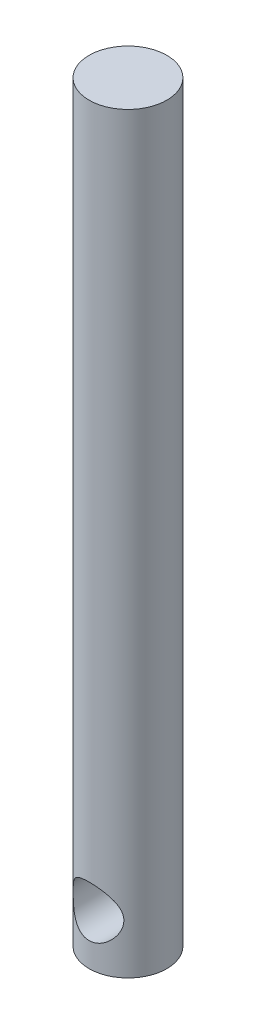
ISO-10303-21;
HEADER;
FILE_DESCRIPTION(('STEP AP214'),'2;1');
FILE_NAME('part.step','',(''),(''),'','','');
FILE_SCHEMA(('AUTOMOTIVE_DESIGN { 1 0 10303 214 1 1 1 1 }'));
ENDSEC;
DATA;
#1=APPLICATION_CONTEXT('core data for automotive mechanical design processes');
#2=APPLICATION_PROTOCOL_DEFINITION('international standard','automotive_design',2000,#1);
#3=PRODUCT_CONTEXT('',#1,'mechanical');
#4=PRODUCT('Part','Part','',(#3));
#5=PRODUCT_RELATED_PRODUCT_CATEGORY('part','',(#4));
#6=PRODUCT_DEFINITION_FORMATION('','',#4);
#7=PRODUCT_DEFINITION_CONTEXT('part definition',#1,'design');
#8=PRODUCT_DEFINITION('design','',#6,#7);
#9=PRODUCT_DEFINITION_SHAPE('','',#8);
#10=(LENGTH_UNIT() NAMED_UNIT(*) SI_UNIT(.MILLI.,.METRE.));
#11=(NAMED_UNIT(*) PLANE_ANGLE_UNIT() SI_UNIT($,.RADIAN.));
#12=(NAMED_UNIT(*) SI_UNIT($,.STERADIAN.) SOLID_ANGLE_UNIT());
#13=UNCERTAINTY_MEASURE_WITH_UNIT(LENGTH_MEASURE(1.E-05),#10,'distance_accuracy_value','');
#14=(GEOMETRIC_REPRESENTATION_CONTEXT(3) GLOBAL_UNCERTAINTY_ASSIGNED_CONTEXT((#13)) GLOBAL_UNIT_ASSIGNED_CONTEXT((#10,
#11,#12)) REPRESENTATION_CONTEXT('',''));
#15=CARTESIAN_POINT('',(0.,0.,0.));
#16=DIRECTION('',(0.,0.,1.));
#17=DIRECTION('',(1.,0.,0.));
#18=AXIS2_PLACEMENT_3D('',#15,#16,#17);
#19=CARTESIAN_POINT('',(0.,3.,0.));
#20=DIRECTION('',(0.,-1.,0.));
#21=DIRECTION('',(0.,0.,-1.));
#22=AXIS2_PLACEMENT_3D('',#19,#20,#21);
#23=CYLINDRICAL_SURFACE('',#22,0.154999999999999);
#24=CARTESIAN_POINT('',(0.,0.299382501811478,-0.154999999999999));
#25=CARTESIAN_POINT('',(-0.00510155987039301,0.299382328133032,-0.154999833363666));
#26=CARTESIAN_POINT('',(-0.0102047309307233,0.298994230021796,-0.154745820783571));
#27=CARTESIAN_POINT('',(-0.0202497795640315,0.297464879941275,-0.153754621499907));
#28=CARTESIAN_POINT('',(-0.0251915264548893,0.296323032887724,-0.153017053032442));
#29=CARTESIAN_POINT('',(-0.0347529387368662,0.293355014721475,-0.151132024552539));
#30=CARTESIAN_POINT('',(-0.0393740024668094,0.291532069323346,-0.149986497828907));
#31=CARTESIAN_POINT('',(-0.0482271863874688,0.287278342839878,-0.147378650966754));
#32=CARTESIAN_POINT('',(-0.0524592645266393,0.284847496142411,-0.145916296634607));
#33=CARTESIAN_POINT('',(-0.0608119302056026,0.279225765670881,-0.142648711989332));
#34=CARTESIAN_POINT('',(-0.0648939246885334,0.275988464313859,-0.140825074530427));
#35=CARTESIAN_POINT('',(-0.0724939151521711,0.268955146203978,-0.137068037272034));
#36=CARTESIAN_POINT('',(-0.0760111097281749,0.265158349959395,-0.135134486687477));
#37=CARTESIAN_POINT('',(-0.0829205474763118,0.25645029737463,-0.131025299192661));
#38=CARTESIAN_POINT('',(-0.0862148559509345,0.251457301091512,-0.128856870006713));
#39=CARTESIAN_POINT('',(-0.0919114575808491,0.240864083451846,-0.124857569093003));
#40=CARTESIAN_POINT('',(-0.0943152906617541,0.235264932218139,-0.123026117407613));
#41=CARTESIAN_POINT('',(-0.0975767036741745,0.225196023566708,-0.120444401937135));
#42=CARTESIAN_POINT('',(-0.0986785221100334,0.220846530000073,-0.119535063091466));
#43=CARTESIAN_POINT('',(-0.100297420261631,0.211972414183993,-0.118180259517313));
#44=CARTESIAN_POINT('',(-0.100815443471888,0.207448086767869,-0.117734046405562));
#45=CARTESIAN_POINT('',(-0.101234682034223,0.198332739752568,-0.117373900933424));
#46=CARTESIAN_POINT('',(-0.101133720461464,0.193741541492049,-0.11746184716279));
#47=CARTESIAN_POINT('',(-0.100317207531066,0.184653080252213,-0.11815972138777));
#48=CARTESIAN_POINT('',(-0.0996011404561673,0.180155899340838,-0.118770087389453));
#49=CARTESIAN_POINT('',(-0.0976358181527735,0.171535798676903,-0.12039008313915));
#50=CARTESIAN_POINT('',(-0.0964067777515211,0.167405226039614,-0.121384478601136));
#51=CARTESIAN_POINT('',(-0.0934701092745859,0.159403671751443,-0.123659941488426));
#52=CARTESIAN_POINT('',(-0.0917623238469365,0.155532775969373,-0.124941103138924));
#53=CARTESIAN_POINT('',(-0.087528533406621,0.147343119588086,-0.127952156978528));
#54=CARTESIAN_POINT('',(-0.0849074238337304,0.143087813750175,-0.129720650637531));
#55=CARTESIAN_POINT('',(-0.0790900435376105,0.135028383523044,-0.133347459975715));
#56=CARTESIAN_POINT('',(-0.0758930754649362,0.131224815546936,-0.135205882538498));
#57=CARTESIAN_POINT('',(-0.0682754787782161,0.123408378506674,-0.13923176246055));
#58=CARTESIAN_POINT('',(-0.0637378741188222,0.119502374444192,-0.141387816993789));
#59=CARTESIAN_POINT('',(-0.0539568030894079,0.112505439838433,-0.145401239817562));
#60=CARTESIAN_POINT('',(-0.0487140612527303,0.10941368217192,-0.147258910456376));
#61=CARTESIAN_POINT('',(-0.0387295340453946,0.104700097666853,-0.150154787932463));
#62=CARTESIAN_POINT('',(-0.0340939123770077,0.10290846243509,-0.15128241069537));
#63=CARTESIAN_POINT('',(-0.024534443129099,0.100013853558087,-0.153123101791206));
#64=CARTESIAN_POINT('',(-0.0196108372492415,0.0989103112294573,-0.153836512421513));
#65=CARTESIAN_POINT('',(-0.00958843279961988,0.0974472862281757,-0.15478526722175));
#66=CARTESIAN_POINT('',(-0.00448904434429662,0.0970906210096371,-0.15501880108462));
#67=CARTESIAN_POINT('',(0.00570334256904216,0.0971518804683452,-0.154978820647786));
#68=CARTESIAN_POINT('',(0.0107963409945298,0.0975698090727134,-0.15470530377738));
#69=CARTESIAN_POINT('',(0.0205063424883452,0.0991057358939189,-0.153710374104947));
#70=CARTESIAN_POINT('',(0.0251334418764158,0.100179535117928,-0.153017262029598));
#71=CARTESIAN_POINT('',(0.0341281616730916,0.102935701190488,-0.151265603658937));
#72=CARTESIAN_POINT('',(0.0384957399811975,0.10461816646707,-0.150206998260578));
#73=CARTESIAN_POINT('',(0.047179157795949,0.108661863389083,-0.147719002713079));
#74=CARTESIAN_POINT('',(0.051471070488421,0.111061619263233,-0.146269219693313));
#75=CARTESIAN_POINT('',(0.0596091401401336,0.116409136691082,-0.143146030170823));
#76=CARTESIAN_POINT('',(0.06345497885447,0.119357285630694,-0.141472465824963));
#77=CARTESIAN_POINT('',(0.0712232159264719,0.126238377090279,-0.13774459306432));
#78=CARTESIAN_POINT('',(0.0750642070730206,0.130253187123094,-0.135671586051804));
#79=CARTESIAN_POINT('',(0.0820504848334758,0.138870076835235,-0.131564215707623));
#80=CARTESIAN_POINT('',(0.0851954582884425,0.143472419400311,-0.129529870145658));
#81=CARTESIAN_POINT('',(0.0904056119656142,0.152655065511205,-0.125939129351962));
#82=CARTESIAN_POINT('',(0.0925532695294196,0.157177346335066,-0.124354677231423));
#83=CARTESIAN_POINT('',(0.096180168293496,0.166591917479324,-0.121571509532941));
#84=CARTESIAN_POINT('',(0.0976606152274104,0.171483521549858,-0.120372099273919));
#85=CARTESIAN_POINT('',(0.099702284452514,0.180759232572636,-0.118684229029616));
#86=CARTESIAN_POINT('',(0.10037034600356,0.185104640205748,-0.118114441240575));
#87=CARTESIAN_POINT('',(0.10113279570465,0.193880586468323,-0.117462477956658));
#88=CARTESIAN_POINT('',(0.101227652949845,0.198311052508337,-0.117379903740466));
#89=CARTESIAN_POINT('',(0.100838064455578,0.207123782503536,-0.11771464290933));
#90=CARTESIAN_POINT('',(0.10035394029282,0.211506071853117,-0.118131678802153));
#91=CARTESIAN_POINT('',(0.0988376244331075,0.220110977781033,-0.119402993907774));
#92=CARTESIAN_POINT('',(0.0978047225301009,0.224333379836539,-0.120257839664686));
#93=CARTESIAN_POINT('',(0.0948677810386326,0.233725092956565,-0.122595032804747));
#94=CARTESIAN_POINT('',(0.0927981504478398,0.238814848652576,-0.124187379791673));
#95=CARTESIAN_POINT('',(0.0879255074462918,0.24851279738789,-0.127683538538626));
#96=CARTESIAN_POINT('',(0.0851214883126857,0.25312031713311,-0.129587776495663));
#97=CARTESIAN_POINT('',(0.078797262840741,0.261876341228093,-0.133529396346754));
#98=CARTESIAN_POINT('',(0.0752663545522886,0.266016359741902,-0.135568416532456));
#99=CARTESIAN_POINT('',(0.0675637694787689,0.273698372124937,-0.139567106265612));
#100=CARTESIAN_POINT('',(0.063391930695129,0.277240214325476,-0.141526755592981));
#101=CARTESIAN_POINT('',(0.0539775254771847,0.283989072436128,-0.145396009436751));
#102=CARTESIAN_POINT('',(0.0486682153198422,0.28712008111048,-0.147277981901897));
#103=CARTESIAN_POINT('',(0.0374402677101189,0.292400102108362,-0.150522841139285));
#104=CARTESIAN_POINT('',(0.0315229816168788,0.294551236926019,-0.151886848792221));
#105=CARTESIAN_POINT('',(0.0212956062110828,0.297206394211437,-0.15358695324426));
#106=CARTESIAN_POINT('',(0.0170953119708869,0.298019278118353,-0.154113479866054));
#107=CARTESIAN_POINT('',(0.00859703693743253,0.299107311820518,-0.154820013347789));
#108=CARTESIAN_POINT('',(0.0042990905581893,0.299382648170511,-0.155000140424634));
#109=CARTESIAN_POINT('',(0.,0.299382501811478,-0.154999999999999));
#110=B_SPLINE_CURVE_WITH_KNOTS('',3,(#24,#25,#26,#27,#28,#29,#30,#31,#32,#33,#34,#35,#36,#37,
#38,#39,#40,#41,#42,#43,#44,#45,#46,#47,#48,#49,#50,#51,#52,#53,#54,#55,#56,#57,#58,#59,#60,#61,
#62,#63,#64,#65,#66,#67,#68,#69,#70,#71,#72,#73,#74,#75,#76,#77,#78,#79,#80,#81,#82,#83,#84,#85,
#86,#87,#88,#89,#90,#91,#92,#93,#94,#95,#96,#97,#98,#99,#100,#101,#102,#103,#104,#105,#106,#107,
#108,#109),.UNSPECIFIED.,.T.,.F.,(4,2,2,2,2,2,2,2,2,2,2,2,2,2,2,2,2,2,2,2,2,2,2,2,2,2,2,2,2,2,2,
2,2,2,2,2,2,2,2,2,2,2,4),(0.,0.0152872280739053,0.0305865398618452,0.0458142933827981,
0.0610436911787003,0.077540577688191,0.0940606689500905,0.113059545252004,0.132025411131395,
0.145704355514299,0.15936116096915,0.173066023910551,0.186782388522006,0.200002805657007,
0.2132275731298,0.229075438813019,0.244942626468061,0.263941607928058,0.282921214851165,
0.298145069911989,0.313356326283403,0.328624861658907,0.343893474444733,0.35823192911358,
0.37257270350631,0.387893368138277,0.403224896702438,0.420944840955464,0.438672741799452,
0.454367222157433,0.470033225756928,0.483273476067732,0.496502889440959,0.509724958370876,
0.522964180600661,0.540034433076922,0.557128209597159,0.574494416772171,0.591865020591326,
0.611088395432813,0.630269930377906,0.643156968836343,0.656039534079736),.UNSPECIFIED.);
#111=CARTESIAN_POINT('',(0.,0.299382501811478,-0.154999999999999));
#112=VERTEX_POINT('',#111);
#113=EDGE_CURVE('E35',#112,#112,#110,.T.);
#114=ORIENTED_EDGE('',*,*,#113,.T.);
#115=EDGE_LOOP('',(#114));
#116=FACE_BOUND('',#115,.T.);
#117=CARTESIAN_POINT('',(0.10113153680832,0.198250965003158,0.117462386587312));
#118=CARTESIAN_POINT('',(0.101131136683058,0.193281854870927,0.117463061639228));
#119=CARTESIAN_POINT('',(0.10076213516487,0.18830974813429,0.117783545385437));
#120=CARTESIAN_POINT('',(0.0993157068549294,0.178540731856244,0.119005087902556));
#121=CARTESIAN_POINT('',(0.0982369873383142,0.173744158904652,0.119907206038618));
#122=CARTESIAN_POINT('',(0.0954532958023699,0.164496063713036,0.122134268014775));
#123=CARTESIAN_POINT('',(0.0937540952602827,0.16004180540339,0.123455300827067));
#124=CARTESIAN_POINT('',(0.089794447276358,0.151487873126067,0.126364499889063));
#125=CARTESIAN_POINT('',(0.0875338747942851,0.147388278431004,0.127952725627983));
#126=CARTESIAN_POINT('',(0.0821266195628282,0.138994891620878,0.131499602494675));
#127=CARTESIAN_POINT('',(0.0788983112986412,0.134762140662917,0.133478289564573));
#128=CARTESIAN_POINT('',(0.0718132028114513,0.126845792087752,0.137420288544412));
#129=CARTESIAN_POINT('',(0.0679558270605848,0.123162703316896,0.139383584632989));
#130=CARTESIAN_POINT('',(0.0590887618072945,0.115952614865607,0.143388493382795));
#131=CARTESIAN_POINT('',(0.0539937097519762,0.112514897423749,0.145404470847004));
#132=CARTESIAN_POINT('',(0.0431407210354922,0.106574367986442,0.148984561891494));
#133=CARTESIAN_POINT('',(0.0373835021850027,0.104070555873939,0.150549158445275));
#134=CARTESIAN_POINT('',(0.0260281452621585,0.100364237019032,0.152896725055294));
#135=CARTESIAN_POINT('',(0.0204805999968233,0.0990499601922443,0.153746114234103));
#136=CARTESIAN_POINT('',(0.00918665088745573,0.0973764705248085,0.154831030955715));
#137=CARTESIAN_POINT('',(0.00344049080874038,0.0970161263066068,0.155067285678099));
#138=CARTESIAN_POINT('',(-0.00717949081173887,0.0972556245642492,0.154911237488159));
#139=CARTESIAN_POINT('',(-0.0120583021945274,0.0977230815395555,0.15460558901381));
#140=CARTESIAN_POINT('',(-0.0216511670536507,0.0993445920529235,0.153556173186866));
#141=CARTESIAN_POINT('',(-0.0263652082684825,0.100498696573725,0.152812373302106));
#142=CARTESIAN_POINT('',(-0.0355039697456552,0.103434918985987,0.150951029298143));
#143=CARTESIAN_POINT('',(-0.0399291314754913,0.105216050690061,0.149834072219891));
#144=CARTESIAN_POINT('',(-0.0484188394734762,0.109338120365198,0.147310061225599));
#145=CARTESIAN_POINT('',(-0.0524833146999479,0.111679168284654,0.145902950340765));
#146=CARTESIAN_POINT('',(-0.0607004509352331,0.11719177005083,0.142696633310057));
#147=CARTESIAN_POINT('',(-0.0647966253391265,0.120431554817371,0.140870255864793));
#148=CARTESIAN_POINT('',(-0.0724229957727844,0.127473179202689,0.137105958459395));
#149=CARTESIAN_POINT('',(-0.075952311443807,0.131275875784115,0.135167871231414));
#150=CARTESIAN_POINT('',(-0.0828747542412799,0.139986672427158,0.131054320354818));
#151=CARTESIAN_POINT('',(-0.0861717177329037,0.144975095588293,0.128885808224173));
#152=CARTESIAN_POINT('',(-0.0918746136222452,0.155558843203593,0.124884765475558));
#153=CARTESIAN_POINT('',(-0.0942821131750731,0.161153077559167,0.123051646829963));
#154=CARTESIAN_POINT('',(-0.0975522374743703,0.171217256739838,0.12046429364037));
#155=CARTESIAN_POINT('',(-0.0986583144872165,0.175567039867813,0.119551789029142));
#156=CARTESIAN_POINT('',(-0.100285562595062,0.184442631619378,0.118190369652004));
#157=CARTESIAN_POINT('',(-0.100807673401985,0.18896814527903,0.117740710174078));
#158=CARTESIAN_POINT('',(-0.101234670822928,0.198086971514838,0.117373924126819));
#159=CARTESIAN_POINT('',(-0.101137358899071,0.202680467791004,0.117458694416797));
#160=CARTESIAN_POINT('',(-0.100327402757443,0.21177420048876,0.118151045972862));
#161=CARTESIAN_POINT('',(-0.0996142460743172,0.2162743560439,0.118759062648601));
#162=CARTESIAN_POINT('',(-0.0976545181096301,0.224897590448466,0.120374874350908));
#163=CARTESIAN_POINT('',(-0.0964285617518855,0.229028452949988,0.121367119353009));
#164=CARTESIAN_POINT('',(-0.0934980197414877,0.237030968445279,0.123638786057206));
#165=CARTESIAN_POINT('',(-0.0917932763010492,0.240902535464518,0.124918302403741));
#166=CARTESIAN_POINT('',(-0.0875670490262214,0.249092261183829,0.127925690211492));
#167=CARTESIAN_POINT('',(-0.0849506991511945,0.253347185064987,0.129692180306252));
#168=CARTESIAN_POINT('',(-0.0791433297975319,0.261406597705867,0.133315708907116));
#169=CARTESIAN_POINT('',(-0.0759516146200866,0.26521053182119,0.135172855024805));
#170=CARTESIAN_POINT('',(-0.06834453815415,0.273030361360885,0.139197723584608));
#171=CARTESIAN_POINT('',(-0.0638120158467401,0.27693932674208,0.1413542083998));
#172=CARTESIAN_POINT('',(-0.0540410378704531,0.283943286064196,0.145369801541898));
#173=CARTESIAN_POINT('',(-0.0488033014815186,0.287039100003983,0.147229208700905));
#174=CARTESIAN_POINT('',(-0.0388244976018606,0.291762528329608,0.150130255456834));
#175=CARTESIAN_POINT('',(-0.0341894465700782,0.293559325404956,0.151260865234814));
#176=CARTESIAN_POINT('',(-0.0246301307614302,0.296464201208652,0.153107755723587));
#177=CARTESIAN_POINT('',(-0.0197061087346825,0.297572849202809,0.153824378867395));
#178=CARTESIAN_POINT('',(-0.00968169465291945,0.299045817327752,0.154779505190189));
#179=CARTESIAN_POINT('',(-0.00458070572514956,0.299407305080318,0.155016188923195));
#180=CARTESIAN_POINT('',(0.00561586402468822,0.299355049616794,0.154982082761091));
#181=CARTESIAN_POINT('',(0.0107114448280555,0.298941303728726,0.154711291116879));
#182=CARTESIAN_POINT('',(0.0204252803737714,0.297412940978942,0.153721187520802));
#183=CARTESIAN_POINT('',(0.0250536497460805,0.296342831239949,0.153030380366724));
#184=CARTESIAN_POINT('',(0.0340514457867952,0.29359368366945,0.151282924778947));
#185=CARTESIAN_POINT('',(0.0384208311890564,0.291914549098611,0.150226218225898));
#186=CARTESIAN_POINT('',(0.0471067571539595,0.287878088118725,0.147742103706588));
#187=CARTESIAN_POINT('',(0.051399533551679,0.285482432159996,0.146294385951304));
#188=CARTESIAN_POINT('',(0.0595398886557225,0.280143108244317,0.143174860511628));
#189=CARTESIAN_POINT('',(0.0633871522884602,0.277199056245344,0.141502896018276));
#190=CARTESIAN_POINT('',(0.0711585848875637,0.270327246744026,0.137778013294817));
#191=CARTESIAN_POINT('',(0.0750015062625798,0.266317700167272,0.135706307483161));
#192=CARTESIAN_POINT('',(0.0819928620387818,0.257711165465115,0.131600199316514));
#193=CARTESIAN_POINT('',(0.0851409289914832,0.253113868548844,0.129565817217671));
#194=CARTESIAN_POINT('',(0.0903615642977304,0.243934708661875,0.125970907791047));
#195=CARTESIAN_POINT('',(0.0925156045316512,0.239410195082264,0.124382806829518));
#196=CARTESIAN_POINT('',(0.096153400241032,0.229991379147495,0.121592814961244));
#197=CARTESIAN_POINT('',(0.0976387140435035,0.225097967852804,0.120390028069064));
#198=CARTESIAN_POINT('',(0.0995327299203725,0.216526811232121,0.118824525419298));
#199=CARTESIAN_POINT('',(0.100129796048406,0.212916485972783,0.118318646213122));
#200=CARTESIAN_POINT('',(0.100929293280501,0.20562163125807,0.117637372157442));
#201=CARTESIAN_POINT('',(0.101131833627016,0.20193712262932,0.117461885824055));
#202=CARTESIAN_POINT('',(0.10113153680832,0.198250965003158,0.117462386587312));
#203=B_SPLINE_CURVE_WITH_KNOTS('',3,(#117,#118,#119,#120,#121,#122,#123,#124,#125,#126,#127,
#128,#129,#130,#131,#132,#133,#134,#135,#136,#137,#138,#139,#140,#141,#142,#143,#144,#145,#146,
#147,#148,#149,#150,#151,#152,#153,#154,#155,#156,#157,#158,#159,#160,#161,#162,#163,#164,#165,
#166,#167,#168,#169,#170,#171,#172,#173,#174,#175,#176,#177,#178,#179,#180,#181,#182,#183,#184,
#185,#186,#187,#188,#189,#190,#191,#192,#193,#194,#195,#196,#197,#198,#199,#200,#201,#202),
.UNSPECIFIED.,.T.,.F.,(4,2,2,2,2,2,2,2,2,2,2,2,2,2,2,2,2,2,2,2,2,2,2,2,2,2,2,2,2,2,2,2,2,2,2,2,
2,2,2,2,2,2,4),(0.,0.0148905948592171,0.0298083877506458,0.0445908155963651,0.0593765390446098,
0.0763503298284211,0.0933397378003284,0.112638703101767,0.131916941440797,0.149102118347178,
0.166266904240536,0.180928053676684,0.195590291821106,0.210229571496469,0.224871728189181,
0.241406159569431,0.257966026470104,0.276958485331859,0.29591731978489,0.309602074113485,
0.323264775261685,0.336975996867797,0.350698639053979,0.363915831747972,0.377137385385973,
0.392975334393951,0.408832563786116,0.427826692585126,0.446801593125745,0.462031315918929,
0.477248423196464,0.492523111345575,0.507797852141652,0.522136474816371,0.536477376079173,
0.551792719867929,0.567118829599397,0.584830592557755,0.602551699416546,0.618263571171081,
0.633938637750765,0.644987755853304,0.656033814068511),.UNSPECIFIED.);
#204=CARTESIAN_POINT('',(0.10113153680832,0.198250965003158,0.117462386587312));
#205=VERTEX_POINT('',#204);
#206=EDGE_CURVE('E48',#205,#205,#203,.T.);
#207=ORIENTED_EDGE('',*,*,#206,.T.);
#208=EDGE_LOOP('',(#207));
#209=FACE_BOUND('',#208,.T.);
#210=CARTESIAN_POINT('',(0.,3.,0.));
#211=DIRECTION('',(0.,1.,0.));
#212=DIRECTION('',(0.,0.,1.));
#213=AXIS2_PLACEMENT_3D('',#210,#211,#212);
#214=CIRCLE('',#213,0.154999999999999);
#215=CARTESIAN_POINT('',(0.,3.,0.154999999999999));
#216=VERTEX_POINT('',#215);
#217=EDGE_CURVE('E10',#216,#216,#214,.T.);
#218=ORIENTED_EDGE('',*,*,#217,.F.);
#219=EDGE_LOOP('',(#218));
#220=FACE_BOUND('',#219,.T.);
#221=CARTESIAN_POINT('',(0.,0.,0.));
#222=DIRECTION('',(0.,1.,0.));
#223=DIRECTION('',(0.,0.,1.));
#224=AXIS2_PLACEMENT_3D('',#221,#222,#223);
#225=CIRCLE('',#224,0.154999999999999);
#226=CARTESIAN_POINT('',(0.,0.,0.154999999999999));
#227=VERTEX_POINT('',#226);
#228=EDGE_CURVE('E42',#227,#227,#225,.T.);
#229=ORIENTED_EDGE('',*,*,#228,.T.);
#230=EDGE_LOOP('',(#229));
#231=FACE_BOUND('',#230,.T.);
#232=ADVANCED_FACE('F31',(#116,#209,#220,#231),#23,.T.);
#233=CARTESIAN_POINT('',(0.,3.,0.));
#234=DIRECTION('',(0.,1.,0.));
#235=DIRECTION('',(0.,0.,1.));
#236=AXIS2_PLACEMENT_3D('',#233,#234,#235);
#237=PLANE('',#236);
#238=ORIENTED_EDGE('',*,*,#217,.T.);
#239=EDGE_LOOP('',(#238));
#240=FACE_BOUND('',#239,.T.);
#241=ADVANCED_FACE('F58',(#240),#237,.T.);
#242=CARTESIAN_POINT('',(0.,0.,0.));
#243=DIRECTION('',(0.,1.,0.));
#244=DIRECTION('',(0.,0.,1.));
#245=AXIS2_PLACEMENT_3D('',#242,#243,#244);
#246=PLANE('',#245);
#247=ORIENTED_EDGE('',*,*,#228,.F.);
#248=EDGE_LOOP('',(#247));
#249=FACE_BOUND('',#248,.T.);
#250=ADVANCED_FACE('F56',(#249),#246,.F.);
#251=CARTESIAN_POINT('',(0.,0.198250965003158,-1.));
#252=DIRECTION('',(0.,0.,1.));
#253=DIRECTION('',(1.,0.,0.));
#254=AXIS2_PLACEMENT_3D('',#251,#252,#253);
#255=CYLINDRICAL_SURFACE('',#254,0.10113153680832);
#256=ORIENTED_EDGE('',*,*,#206,.F.);
#257=EDGE_LOOP('',(#256));
#258=FACE_BOUND('',#257,.T.);
#259=ORIENTED_EDGE('',*,*,#113,.F.);
#260=EDGE_LOOP('',(#259));
#261=FACE_BOUND('',#260,.T.);
#262=ADVANCED_FACE('F52',(#258,#261),#255,.F.);
#263=CLOSED_SHELL('',(#232,#241,#250,#262));
#264=MANIFOLD_SOLID_BREP('B2',#263);
#265=ADVANCED_BREP_SHAPE_REPRESENTATION('',(#18,#264),#14);
#266=SHAPE_DEFINITION_REPRESENTATION(#9,#265);
ENDSEC;
END-ISO-10303-21;
